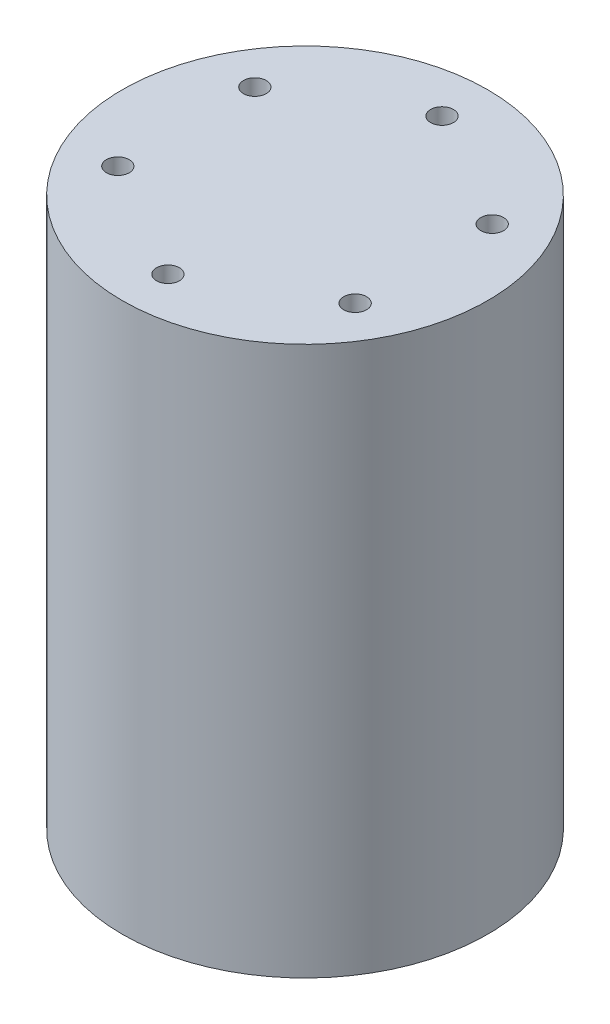
ISO-10303-21;
HEADER;
FILE_DESCRIPTION(('STEP AP214'),'2;1');
FILE_NAME('part.step','',(''),(''),'','','');
FILE_SCHEMA(('AUTOMOTIVE_DESIGN { 1 0 10303 214 1 1 1 1 }'));
ENDSEC;
DATA;
#1=APPLICATION_CONTEXT('core data for automotive mechanical design processes');
#2=APPLICATION_PROTOCOL_DEFINITION('international standard','automotive_design',2000,#1);
#3=PRODUCT_CONTEXT('',#1,'mechanical');
#4=PRODUCT('Part','Part','',(#3));
#5=PRODUCT_RELATED_PRODUCT_CATEGORY('part','',(#4));
#6=PRODUCT_DEFINITION_FORMATION('','',#4);
#7=PRODUCT_DEFINITION_CONTEXT('part definition',#1,'design');
#8=PRODUCT_DEFINITION('design','',#6,#7);
#9=PRODUCT_DEFINITION_SHAPE('','',#8);
#10=(LENGTH_UNIT() NAMED_UNIT(*) SI_UNIT(.MILLI.,.METRE.));
#11=(NAMED_UNIT(*) PLANE_ANGLE_UNIT() SI_UNIT($,.RADIAN.));
#12=(NAMED_UNIT(*) SI_UNIT($,.STERADIAN.) SOLID_ANGLE_UNIT());
#13=UNCERTAINTY_MEASURE_WITH_UNIT(LENGTH_MEASURE(1.E-05),#10,'distance_accuracy_value','');
#14=(GEOMETRIC_REPRESENTATION_CONTEXT(3) GLOBAL_UNCERTAINTY_ASSIGNED_CONTEXT((#13)) GLOBAL_UNIT_ASSIGNED_CONTEXT((#10,
#11,#12)) REPRESENTATION_CONTEXT('',''));
#15=CARTESIAN_POINT('',(0.,0.,0.));
#16=DIRECTION('',(0.,0.,1.));
#17=DIRECTION('',(1.,0.,0.));
#18=AXIS2_PLACEMENT_3D('',#15,#16,#17);
#19=CARTESIAN_POINT('',(0.,60.075,0.));
#20=DIRECTION('',(0.,-1.,0.));
#21=DIRECTION('',(0.,0.,-1.));
#22=AXIS2_PLACEMENT_3D('',#19,#20,#21);
#23=CYLINDRICAL_SURFACE('',#22,40.);
#24=CARTESIAN_POINT('',(0.,0.,0.));
#25=DIRECTION('',(0.,1.,0.));
#26=DIRECTION('',(0.,0.,1.));
#27=AXIS2_PLACEMENT_3D('',#24,#25,#26);
#28=CIRCLE('',#27,40.);
#29=CARTESIAN_POINT('',(0.,0.,40.));
#30=VERTEX_POINT('',#29);
#31=EDGE_CURVE('E11',#30,#30,#28,.T.);
#32=ORIENTED_EDGE('',*,*,#31,.T.);
#33=EDGE_LOOP('',(#32));
#34=FACE_BOUND('',#33,.T.);
#35=CARTESIAN_POINT('',(0.,120.15,0.));
#36=DIRECTION('',(0.,1.,0.));
#37=DIRECTION('',(0.,0.,1.));
#38=AXIS2_PLACEMENT_3D('',#35,#36,#37);
#39=CIRCLE('',#38,40.);
#40=CARTESIAN_POINT('',(0.,120.15,40.));
#41=VERTEX_POINT('',#40);
#42=EDGE_CURVE('E141',#41,#41,#39,.T.);
#43=ORIENTED_EDGE('',*,*,#42,.F.);
#44=EDGE_LOOP('',(#43));
#45=FACE_BOUND('',#44,.T.);
#46=ADVANCED_FACE('F39',(#34,#45),#23,.T.);
#47=CARTESIAN_POINT('',(0.,0.,0.));
#48=DIRECTION('',(0.,1.,0.));
#49=DIRECTION('',(0.,0.,1.));
#50=AXIS2_PLACEMENT_3D('',#47,#48,#49);
#51=PLANE('',#50);
#52=CARTESIAN_POINT('',(25.9807621135332,0.,15.));
#53=DIRECTION('',(0.,-1.,0.));
#54=DIRECTION('',(0.,0.,-1.));
#55=AXIS2_PLACEMENT_3D('',#52,#53,#54);
#56=CIRCLE('',#55,2.49999999999999);
#57=CARTESIAN_POINT('',(25.9807621135332,0.,12.5));
#58=VERTEX_POINT('',#57);
#59=EDGE_CURVE('E145',#58,#58,#56,.T.);
#60=ORIENTED_EDGE('',*,*,#59,.F.);
#61=EDGE_LOOP('',(#60));
#62=FACE_BOUND('',#61,.T.);
#63=CARTESIAN_POINT('',(25.9807621135332,0.,-15.));
#64=DIRECTION('',(0.,-1.,0.));
#65=DIRECTION('',(0.,0.,-1.));
#66=AXIS2_PLACEMENT_3D('',#63,#64,#65);
#67=CIRCLE('',#66,2.49999999999999);
#68=CARTESIAN_POINT('',(25.9807621135332,0.,-17.5));
#69=VERTEX_POINT('',#68);
#70=EDGE_CURVE('E153',#69,#69,#67,.T.);
#71=ORIENTED_EDGE('',*,*,#70,.F.);
#72=EDGE_LOOP('',(#71));
#73=FACE_BOUND('',#72,.T.);
#74=CARTESIAN_POINT('',(0.,0.,-30.));
#75=DIRECTION('',(0.,-1.,0.));
#76=DIRECTION('',(0.,0.,-1.));
#77=AXIS2_PLACEMENT_3D('',#74,#75,#76);
#78=CIRCLE('',#77,2.49999999999999);
#79=CARTESIAN_POINT('',(0.,0.,-32.5));
#80=VERTEX_POINT('',#79);
#81=EDGE_CURVE('E161',#80,#80,#78,.T.);
#82=ORIENTED_EDGE('',*,*,#81,.F.);
#83=EDGE_LOOP('',(#82));
#84=FACE_BOUND('',#83,.T.);
#85=CARTESIAN_POINT('',(-25.9807621135332,0.,-15.));
#86=DIRECTION('',(0.,-1.,0.));
#87=DIRECTION('',(0.,0.,-1.));
#88=AXIS2_PLACEMENT_3D('',#85,#86,#87);
#89=CIRCLE('',#88,2.49999999999999);
#90=CARTESIAN_POINT('',(-25.9807621135332,0.,-17.5));
#91=VERTEX_POINT('',#90);
#92=EDGE_CURVE('E169',#91,#91,#89,.T.);
#93=ORIENTED_EDGE('',*,*,#92,.F.);
#94=EDGE_LOOP('',(#93));
#95=FACE_BOUND('',#94,.T.);
#96=CARTESIAN_POINT('',(-25.9807621135332,0.,15.));
#97=DIRECTION('',(0.,-1.,0.));
#98=DIRECTION('',(0.,0.,-1.));
#99=AXIS2_PLACEMENT_3D('',#96,#97,#98);
#100=CIRCLE('',#99,2.49999999999999);
#101=CARTESIAN_POINT('',(-25.9807621135332,0.,12.5));
#102=VERTEX_POINT('',#101);
#103=EDGE_CURVE('E177',#102,#102,#100,.T.);
#104=ORIENTED_EDGE('',*,*,#103,.F.);
#105=EDGE_LOOP('',(#104));
#106=FACE_BOUND('',#105,.T.);
#107=CARTESIAN_POINT('',(0.,0.,30.));
#108=DIRECTION('',(0.,-1.,0.));
#109=DIRECTION('',(0.,0.,-1.));
#110=AXIS2_PLACEMENT_3D('',#107,#108,#109);
#111=CIRCLE('',#110,2.49999999999999);
#112=CARTESIAN_POINT('',(0.,0.,27.5));
#113=VERTEX_POINT('',#112);
#114=EDGE_CURVE('E185',#113,#113,#111,.T.);
#115=ORIENTED_EDGE('',*,*,#114,.F.);
#116=EDGE_LOOP('',(#115));
#117=FACE_BOUND('',#116,.T.);
#118=ORIENTED_EDGE('',*,*,#31,.F.);
#119=EDGE_LOOP('',(#118));
#120=FACE_BOUND('',#119,.T.);
#121=ADVANCED_FACE('F201',(#62,#73,#84,#95,#106,#117,#120),#51,.F.);
#122=CARTESIAN_POINT('',(0.,10.,30.));
#123=DIRECTION('',(0.,-1.,0.));
#124=DIRECTION('',(0.,0.,-1.));
#125=AXIS2_PLACEMENT_3D('',#122,#123,#124);
#126=CONICAL_SURFACE('',#125,2.5,1.02974425867665);
#127=CARTESIAN_POINT('',(0.,11.5021515475689,30.));
#128=VERTEX_POINT('',#127);
#129=VERTEX_LOOP('',#128);
#130=FACE_BOUND('',#129,.T.);
#131=CARTESIAN_POINT('',(0.,10.,30.));
#132=DIRECTION('',(0.,-1.,0.));
#133=DIRECTION('',(0.,0.,-1.));
#134=AXIS2_PLACEMENT_3D('',#131,#132,#133);
#135=CIRCLE('',#134,2.5);
#136=CARTESIAN_POINT('',(0.,10.,27.5));
#137=VERTEX_POINT('',#136);
#138=EDGE_CURVE('E47',#137,#137,#135,.T.);
#139=ORIENTED_EDGE('',*,*,#138,.T.);
#140=EDGE_LOOP('',(#139));
#141=FACE_BOUND('',#140,.T.);
#142=ADVANCED_FACE('F192',(#130,#141),#126,.F.);
#143=CARTESIAN_POINT('',(0.,0.,30.));
#144=DIRECTION('',(0.,-1.,0.));
#145=DIRECTION('',(0.,0.,-1.));
#146=AXIS2_PLACEMENT_3D('',#143,#144,#145);
#147=CYLINDRICAL_SURFACE('',#146,2.49999999999999);
#148=ORIENTED_EDGE('',*,*,#138,.F.);
#149=EDGE_LOOP('',(#148));
#150=FACE_BOUND('',#149,.T.);
#151=ORIENTED_EDGE('',*,*,#114,.T.);
#152=EDGE_LOOP('',(#151));
#153=FACE_BOUND('',#152,.T.);
#154=ADVANCED_FACE('F194',(#150,#153),#147,.F.);
#155=CARTESIAN_POINT('',(-25.9807621135332,10.,15.));
#156=DIRECTION('',(0.,-1.,0.));
#157=DIRECTION('',(0.,0.,-1.));
#158=AXIS2_PLACEMENT_3D('',#155,#156,#157);
#159=CONICAL_SURFACE('',#158,2.5,1.02974425867665);
#160=CARTESIAN_POINT('',(-25.9807621135332,11.5021515475689,15.));
#161=VERTEX_POINT('',#160);
#162=VERTEX_LOOP('',#161);
#163=FACE_BOUND('',#162,.T.);
#164=CARTESIAN_POINT('',(-25.9807621135332,10.,15.));
#165=DIRECTION('',(0.,-1.,0.));
#166=DIRECTION('',(0.,0.,-1.));
#167=AXIS2_PLACEMENT_3D('',#164,#165,#166);
#168=CIRCLE('',#167,2.5);
#169=CARTESIAN_POINT('',(-25.9807621135332,10.,12.5));
#170=VERTEX_POINT('',#169);
#171=EDGE_CURVE('E181',#170,#170,#168,.T.);
#172=ORIENTED_EDGE('',*,*,#171,.T.);
#173=EDGE_LOOP('',(#172));
#174=FACE_BOUND('',#173,.T.);
#175=ADVANCED_FACE('F197',(#163,#174),#159,.F.);
#176=CARTESIAN_POINT('',(-25.9807621135332,0.,15.));
#177=DIRECTION('',(0.,-1.,0.));
#178=DIRECTION('',(0.,0.,-1.));
#179=AXIS2_PLACEMENT_3D('',#176,#177,#178);
#180=CYLINDRICAL_SURFACE('',#179,2.49999999999999);
#181=ORIENTED_EDGE('',*,*,#171,.F.);
#182=EDGE_LOOP('',(#181));
#183=FACE_BOUND('',#182,.T.);
#184=ORIENTED_EDGE('',*,*,#103,.T.);
#185=EDGE_LOOP('',(#184));
#186=FACE_BOUND('',#185,.T.);
#187=ADVANCED_FACE('F257',(#183,#186),#180,.F.);
#188=CARTESIAN_POINT('',(-25.9807621135332,10.,-15.));
#189=DIRECTION('',(0.,-1.,0.));
#190=DIRECTION('',(0.,0.,-1.));
#191=AXIS2_PLACEMENT_3D('',#188,#189,#190);
#192=CONICAL_SURFACE('',#191,2.5,1.02974425867665);
#193=CARTESIAN_POINT('',(-25.9807621135332,11.5021515475689,-15.));
#194=VERTEX_POINT('',#193);
#195=VERTEX_LOOP('',#194);
#196=FACE_BOUND('',#195,.T.);
#197=CARTESIAN_POINT('',(-25.9807621135332,10.,-15.));
#198=DIRECTION('',(0.,-1.,0.));
#199=DIRECTION('',(0.,0.,-1.));
#200=AXIS2_PLACEMENT_3D('',#197,#198,#199);
#201=CIRCLE('',#200,2.5);
#202=CARTESIAN_POINT('',(-25.9807621135332,10.,-17.5));
#203=VERTEX_POINT('',#202);
#204=EDGE_CURVE('E173',#203,#203,#201,.T.);
#205=ORIENTED_EDGE('',*,*,#204,.T.);
#206=EDGE_LOOP('',(#205));
#207=FACE_BOUND('',#206,.T.);
#208=ADVANCED_FACE('F253',(#196,#207),#192,.F.);
#209=CARTESIAN_POINT('',(-25.9807621135332,0.,-15.));
#210=DIRECTION('',(0.,-1.,0.));
#211=DIRECTION('',(0.,0.,-1.));
#212=AXIS2_PLACEMENT_3D('',#209,#210,#211);
#213=CYLINDRICAL_SURFACE('',#212,2.5);
#214=ORIENTED_EDGE('',*,*,#204,.F.);
#215=EDGE_LOOP('',(#214));
#216=FACE_BOUND('',#215,.T.);
#217=ORIENTED_EDGE('',*,*,#92,.T.);
#218=EDGE_LOOP('',(#217));
#219=FACE_BOUND('',#218,.T.);
#220=ADVANCED_FACE('F249',(#216,#219),#213,.F.);
#221=CARTESIAN_POINT('',(0.,10.,-30.));
#222=DIRECTION('',(0.,-1.,0.));
#223=DIRECTION('',(0.,0.,-1.));
#224=AXIS2_PLACEMENT_3D('',#221,#222,#223);
#225=CONICAL_SURFACE('',#224,2.5,1.02974425867665);
#226=CARTESIAN_POINT('',(0.,11.5021515475689,-30.));
#227=VERTEX_POINT('',#226);
#228=VERTEX_LOOP('',#227);
#229=FACE_BOUND('',#228,.T.);
#230=CARTESIAN_POINT('',(0.,10.,-30.));
#231=DIRECTION('',(0.,-1.,0.));
#232=DIRECTION('',(0.,0.,-1.));
#233=AXIS2_PLACEMENT_3D('',#230,#231,#232);
#234=CIRCLE('',#233,2.5);
#235=CARTESIAN_POINT('',(0.,10.,-32.5));
#236=VERTEX_POINT('',#235);
#237=EDGE_CURVE('E165',#236,#236,#234,.T.);
#238=ORIENTED_EDGE('',*,*,#237,.T.);
#239=EDGE_LOOP('',(#238));
#240=FACE_BOUND('',#239,.T.);
#241=ADVANCED_FACE('F245',(#229,#240),#225,.F.);
#242=CARTESIAN_POINT('',(0.,0.,-30.));
#243=DIRECTION('',(0.,-1.,0.));
#244=DIRECTION('',(0.,0.,-1.));
#245=AXIS2_PLACEMENT_3D('',#242,#243,#244);
#246=CYLINDRICAL_SURFACE('',#245,2.49999999999999);
#247=ORIENTED_EDGE('',*,*,#237,.F.);
#248=EDGE_LOOP('',(#247));
#249=FACE_BOUND('',#248,.T.);
#250=ORIENTED_EDGE('',*,*,#81,.T.);
#251=EDGE_LOOP('',(#250));
#252=FACE_BOUND('',#251,.T.);
#253=ADVANCED_FACE('F241',(#249,#252),#246,.F.);
#254=CARTESIAN_POINT('',(25.9807621135332,10.,-15.));
#255=DIRECTION('',(0.,-1.,0.));
#256=DIRECTION('',(0.,0.,-1.));
#257=AXIS2_PLACEMENT_3D('',#254,#255,#256);
#258=CONICAL_SURFACE('',#257,2.5,1.02974425867665);
#259=CARTESIAN_POINT('',(25.9807621135331,11.5021515475689,-15.));
#260=VERTEX_POINT('',#259);
#261=VERTEX_LOOP('',#260);
#262=FACE_BOUND('',#261,.T.);
#263=CARTESIAN_POINT('',(25.9807621135332,10.,-15.));
#264=DIRECTION('',(0.,-1.,0.));
#265=DIRECTION('',(0.,0.,-1.));
#266=AXIS2_PLACEMENT_3D('',#263,#264,#265);
#267=CIRCLE('',#266,2.5);
#268=CARTESIAN_POINT('',(25.9807621135332,10.,-17.5));
#269=VERTEX_POINT('',#268);
#270=EDGE_CURVE('E157',#269,#269,#267,.T.);
#271=ORIENTED_EDGE('',*,*,#270,.T.);
#272=EDGE_LOOP('',(#271));
#273=FACE_BOUND('',#272,.T.);
#274=ADVANCED_FACE('F237',(#262,#273),#258,.F.);
#275=CARTESIAN_POINT('',(25.9807621135332,0.,-15.));
#276=DIRECTION('',(0.,-1.,0.));
#277=DIRECTION('',(0.,0.,-1.));
#278=AXIS2_PLACEMENT_3D('',#275,#276,#277);
#279=CYLINDRICAL_SURFACE('',#278,2.49999999999999);
#280=ORIENTED_EDGE('',*,*,#270,.F.);
#281=EDGE_LOOP('',(#280));
#282=FACE_BOUND('',#281,.T.);
#283=ORIENTED_EDGE('',*,*,#70,.T.);
#284=EDGE_LOOP('',(#283));
#285=FACE_BOUND('',#284,.T.);
#286=ADVANCED_FACE('F233',(#282,#285),#279,.F.);
#287=CARTESIAN_POINT('',(25.9807621135332,10.,15.));
#288=DIRECTION('',(0.,-1.,0.));
#289=DIRECTION('',(0.,0.,-1.));
#290=AXIS2_PLACEMENT_3D('',#287,#288,#289);
#291=CONICAL_SURFACE('',#290,2.5,1.02974425867665);
#292=CARTESIAN_POINT('',(25.9807621135332,11.5021515475689,15.));
#293=VERTEX_POINT('',#292);
#294=VERTEX_LOOP('',#293);
#295=FACE_BOUND('',#294,.T.);
#296=CARTESIAN_POINT('',(25.9807621135332,10.,15.));
#297=DIRECTION('',(0.,-1.,0.));
#298=DIRECTION('',(0.,0.,-1.));
#299=AXIS2_PLACEMENT_3D('',#296,#297,#298);
#300=CIRCLE('',#299,2.5);
#301=CARTESIAN_POINT('',(25.9807621135332,10.,12.5));
#302=VERTEX_POINT('',#301);
#303=EDGE_CURVE('E149',#302,#302,#300,.T.);
#304=ORIENTED_EDGE('',*,*,#303,.T.);
#305=EDGE_LOOP('',(#304));
#306=FACE_BOUND('',#305,.T.);
#307=ADVANCED_FACE('F224',(#295,#306),#291,.F.);
#308=CARTESIAN_POINT('',(25.9807621135332,0.,15.));
#309=DIRECTION('',(0.,-1.,0.));
#310=DIRECTION('',(0.,0.,-1.));
#311=AXIS2_PLACEMENT_3D('',#308,#309,#310);
#312=CYLINDRICAL_SURFACE('',#311,2.5);
#313=ORIENTED_EDGE('',*,*,#303,.F.);
#314=EDGE_LOOP('',(#313));
#315=FACE_BOUND('',#314,.T.);
#316=ORIENTED_EDGE('',*,*,#59,.T.);
#317=EDGE_LOOP('',(#316));
#318=FACE_BOUND('',#317,.T.);
#319=ADVANCED_FACE('F214',(#315,#318),#312,.F.);
#320=CARTESIAN_POINT('',(0.,120.15,0.));
#321=DIRECTION('',(0.,-1.,0.));
#322=DIRECTION('',(0.,0.,1.));
#323=AXIS2_PLACEMENT_3D('',#320,#321,#322);
#324=PLANE('',#323);
#325=CARTESIAN_POINT('',(25.9807621135332,120.15,15.));
#326=DIRECTION('',(0.,1.,0.));
#327=DIRECTION('',(0.,0.,1.));
#328=AXIS2_PLACEMENT_3D('',#325,#326,#327);
#329=CIRCLE('',#328,2.49999999999999);
#330=CARTESIAN_POINT('',(25.9807621135332,120.15,17.5));
#331=VERTEX_POINT('',#330);
#332=EDGE_CURVE('E96',#331,#331,#329,.T.);
#333=ORIENTED_EDGE('',*,*,#332,.F.);
#334=EDGE_LOOP('',(#333));
#335=FACE_BOUND('',#334,.T.);
#336=CARTESIAN_POINT('',(25.9807621135332,120.15,-15.));
#337=DIRECTION('',(0.,1.,0.));
#338=DIRECTION('',(0.,0.,1.));
#339=AXIS2_PLACEMENT_3D('',#336,#337,#338);
#340=CIRCLE('',#339,2.49999999999999);
#341=CARTESIAN_POINT('',(25.9807621135332,120.15,-12.5));
#342=VERTEX_POINT('',#341);
#343=EDGE_CURVE('E95',#342,#342,#340,.T.);
#344=ORIENTED_EDGE('',*,*,#343,.F.);
#345=EDGE_LOOP('',(#344));
#346=FACE_BOUND('',#345,.T.);
#347=CARTESIAN_POINT('',(0.,120.15,-30.));
#348=DIRECTION('',(0.,1.,0.));
#349=DIRECTION('',(0.,0.,1.));
#350=AXIS2_PLACEMENT_3D('',#347,#348,#349);
#351=CIRCLE('',#350,2.49999999999999);
#352=CARTESIAN_POINT('',(0.,120.15,-27.5));
#353=VERTEX_POINT('',#352);
#354=EDGE_CURVE('E109',#353,#353,#351,.T.);
#355=ORIENTED_EDGE('',*,*,#354,.F.);
#356=EDGE_LOOP('',(#355));
#357=FACE_BOUND('',#356,.T.);
#358=CARTESIAN_POINT('',(-25.9807621135332,120.15,-15.));
#359=DIRECTION('',(0.,1.,0.));
#360=DIRECTION('',(0.,0.,1.));
#361=AXIS2_PLACEMENT_3D('',#358,#359,#360);
#362=CIRCLE('',#361,2.49999999999999);
#363=CARTESIAN_POINT('',(-25.9807621135332,120.15,-12.5));
#364=VERTEX_POINT('',#363);
#365=EDGE_CURVE('E117',#364,#364,#362,.T.);
#366=ORIENTED_EDGE('',*,*,#365,.F.);
#367=EDGE_LOOP('',(#366));
#368=FACE_BOUND('',#367,.T.);
#369=CARTESIAN_POINT('',(-25.9807621135332,120.15,15.));
#370=DIRECTION('',(0.,1.,0.));
#371=DIRECTION('',(0.,0.,1.));
#372=AXIS2_PLACEMENT_3D('',#369,#370,#371);
#373=CIRCLE('',#372,2.49999999999999);
#374=CARTESIAN_POINT('',(-25.9807621135332,120.15,17.5));
#375=VERTEX_POINT('',#374);
#376=EDGE_CURVE('E125',#375,#375,#373,.T.);
#377=ORIENTED_EDGE('',*,*,#376,.F.);
#378=EDGE_LOOP('',(#377));
#379=FACE_BOUND('',#378,.T.);
#380=CARTESIAN_POINT('',(0.,120.15,30.));
#381=DIRECTION('',(0.,1.,0.));
#382=DIRECTION('',(0.,0.,1.));
#383=AXIS2_PLACEMENT_3D('',#380,#381,#382);
#384=CIRCLE('',#383,2.49999999999999);
#385=CARTESIAN_POINT('',(0.,120.15,32.5));
#386=VERTEX_POINT('',#385);
#387=EDGE_CURVE('E133',#386,#386,#384,.T.);
#388=ORIENTED_EDGE('',*,*,#387,.F.);
#389=EDGE_LOOP('',(#388));
#390=FACE_BOUND('',#389,.T.);
#391=ORIENTED_EDGE('',*,*,#42,.T.);
#392=EDGE_LOOP('',(#391));
#393=FACE_BOUND('',#392,.T.);
#394=ADVANCED_FACE('F211',(#335,#346,#357,#368,#379,#390,#393),#324,.F.);
#395=CARTESIAN_POINT('',(0.,110.15,30.));
#396=DIRECTION('',(0.,1.,0.));
#397=DIRECTION('',(0.,0.,1.));
#398=AXIS2_PLACEMENT_3D('',#395,#396,#397);
#399=CONICAL_SURFACE('',#398,2.5,1.02974425867665);
#400=CARTESIAN_POINT('',(0.,108.647848452431,30.));
#401=VERTEX_POINT('',#400);
#402=VERTEX_LOOP('',#401);
#403=FACE_BOUND('',#402,.T.);
#404=CARTESIAN_POINT('',(0.,110.15,30.));
#405=DIRECTION('',(0.,1.,0.));
#406=DIRECTION('',(0.,0.,1.));
#407=AXIS2_PLACEMENT_3D('',#404,#405,#406);
#408=CIRCLE('',#407,2.5);
#409=CARTESIAN_POINT('',(0.,110.15,32.5));
#410=VERTEX_POINT('',#409);
#411=EDGE_CURVE('E137',#410,#410,#408,.T.);
#412=ORIENTED_EDGE('',*,*,#411,.T.);
#413=EDGE_LOOP('',(#412));
#414=FACE_BOUND('',#413,.T.);
#415=ADVANCED_FACE('F213',(#403,#414),#399,.F.);
#416=CARTESIAN_POINT('',(0.,120.15,30.));
#417=DIRECTION('',(0.,1.,0.));
#418=DIRECTION('',(0.,0.,1.));
#419=AXIS2_PLACEMENT_3D('',#416,#417,#418);
#420=CYLINDRICAL_SURFACE('',#419,2.49999999999999);
#421=ORIENTED_EDGE('',*,*,#411,.F.);
#422=EDGE_LOOP('',(#421));
#423=FACE_BOUND('',#422,.T.);
#424=ORIENTED_EDGE('',*,*,#387,.T.);
#425=EDGE_LOOP('',(#424));
#426=FACE_BOUND('',#425,.T.);
#427=ADVANCED_FACE('F220',(#423,#426),#420,.F.);
#428=CARTESIAN_POINT('',(-25.9807621135332,110.15,15.));
#429=DIRECTION('',(0.,1.,0.));
#430=DIRECTION('',(0.,0.,1.));
#431=AXIS2_PLACEMENT_3D('',#428,#429,#430);
#432=CONICAL_SURFACE('',#431,2.5,1.02974425867665);
#433=CARTESIAN_POINT('',(-25.9807621135332,108.647848452431,15.));
#434=VERTEX_POINT('',#433);
#435=VERTEX_LOOP('',#434);
#436=FACE_BOUND('',#435,.T.);
#437=CARTESIAN_POINT('',(-25.9807621135332,110.15,15.));
#438=DIRECTION('',(0.,1.,0.));
#439=DIRECTION('',(0.,0.,1.));
#440=AXIS2_PLACEMENT_3D('',#437,#438,#439);
#441=CIRCLE('',#440,2.5);
#442=CARTESIAN_POINT('',(-25.9807621135332,110.15,17.5));
#443=VERTEX_POINT('',#442);
#444=EDGE_CURVE('E129',#443,#443,#441,.T.);
#445=ORIENTED_EDGE('',*,*,#444,.T.);
#446=EDGE_LOOP('',(#445));
#447=FACE_BOUND('',#446,.T.);
#448=ADVANCED_FACE('F337',(#436,#447),#432,.F.);
#449=CARTESIAN_POINT('',(-25.9807621135332,120.15,15.));
#450=DIRECTION('',(0.,1.,0.));
#451=DIRECTION('',(0.,0.,1.));
#452=AXIS2_PLACEMENT_3D('',#449,#450,#451);
#453=CYLINDRICAL_SURFACE('',#452,2.49999999999999);
#454=ORIENTED_EDGE('',*,*,#444,.F.);
#455=EDGE_LOOP('',(#454));
#456=FACE_BOUND('',#455,.T.);
#457=ORIENTED_EDGE('',*,*,#376,.T.);
#458=EDGE_LOOP('',(#457));
#459=FACE_BOUND('',#458,.T.);
#460=ADVANCED_FACE('F346',(#456,#459),#453,.F.);
#461=CARTESIAN_POINT('',(-25.9807621135332,110.15,-15.));
#462=DIRECTION('',(0.,1.,0.));
#463=DIRECTION('',(0.,0.,1.));
#464=AXIS2_PLACEMENT_3D('',#461,#462,#463);
#465=CONICAL_SURFACE('',#464,2.5,1.02974425867665);
#466=CARTESIAN_POINT('',(-25.9807621135332,108.647848452431,-15.));
#467=VERTEX_POINT('',#466);
#468=VERTEX_LOOP('',#467);
#469=FACE_BOUND('',#468,.T.);
#470=CARTESIAN_POINT('',(-25.9807621135332,110.15,-15.));
#471=DIRECTION('',(0.,1.,0.));
#472=DIRECTION('',(0.,0.,1.));
#473=AXIS2_PLACEMENT_3D('',#470,#471,#472);
#474=CIRCLE('',#473,2.5);
#475=CARTESIAN_POINT('',(-25.9807621135332,110.15,-12.5));
#476=VERTEX_POINT('',#475);
#477=EDGE_CURVE('E121',#476,#476,#474,.T.);
#478=ORIENTED_EDGE('',*,*,#477,.T.);
#479=EDGE_LOOP('',(#478));
#480=FACE_BOUND('',#479,.T.);
#481=ADVANCED_FACE('F356',(#469,#480),#465,.F.);
#482=CARTESIAN_POINT('',(-25.9807621135332,120.15,-15.));
#483=DIRECTION('',(0.,1.,0.));
#484=DIRECTION('',(0.,0.,1.));
#485=AXIS2_PLACEMENT_3D('',#482,#483,#484);
#486=CYLINDRICAL_SURFACE('',#485,2.5);
#487=ORIENTED_EDGE('',*,*,#477,.F.);
#488=EDGE_LOOP('',(#487));
#489=FACE_BOUND('',#488,.T.);
#490=ORIENTED_EDGE('',*,*,#365,.T.);
#491=EDGE_LOOP('',(#490));
#492=FACE_BOUND('',#491,.T.);
#493=ADVANCED_FACE('F366',(#489,#492),#486,.F.);
#494=CARTESIAN_POINT('',(0.,110.15,-30.));
#495=DIRECTION('',(0.,1.,0.));
#496=DIRECTION('',(0.,0.,1.));
#497=AXIS2_PLACEMENT_3D('',#494,#495,#496);
#498=CONICAL_SURFACE('',#497,2.5,1.02974425867665);
#499=CARTESIAN_POINT('',(0.,108.647848452431,-30.));
#500=VERTEX_POINT('',#499);
#501=VERTEX_LOOP('',#500);
#502=FACE_BOUND('',#501,.T.);
#503=CARTESIAN_POINT('',(0.,110.15,-30.));
#504=DIRECTION('',(0.,1.,0.));
#505=DIRECTION('',(0.,0.,1.));
#506=AXIS2_PLACEMENT_3D('',#503,#504,#505);
#507=CIRCLE('',#506,2.5);
#508=CARTESIAN_POINT('',(0.,110.15,-27.5));
#509=VERTEX_POINT('',#508);
#510=EDGE_CURVE('E113',#509,#509,#507,.T.);
#511=ORIENTED_EDGE('',*,*,#510,.T.);
#512=EDGE_LOOP('',(#511));
#513=FACE_BOUND('',#512,.T.);
#514=ADVANCED_FACE('F376',(#502,#513),#498,.F.);
#515=CARTESIAN_POINT('',(0.,120.15,-30.));
#516=DIRECTION('',(0.,1.,0.));
#517=DIRECTION('',(0.,0.,1.));
#518=AXIS2_PLACEMENT_3D('',#515,#516,#517);
#519=CYLINDRICAL_SURFACE('',#518,2.49999999999999);
#520=ORIENTED_EDGE('',*,*,#510,.F.);
#521=EDGE_LOOP('',(#520));
#522=FACE_BOUND('',#521,.T.);
#523=ORIENTED_EDGE('',*,*,#354,.T.);
#524=EDGE_LOOP('',(#523));
#525=FACE_BOUND('',#524,.T.);
#526=ADVANCED_FACE('F386',(#522,#525),#519,.F.);
#527=CARTESIAN_POINT('',(25.9807621135332,110.15,-15.));
#528=DIRECTION('',(0.,1.,0.));
#529=DIRECTION('',(0.,0.,1.));
#530=AXIS2_PLACEMENT_3D('',#527,#528,#529);
#531=CONICAL_SURFACE('',#530,2.5,1.02974425867665);
#532=CARTESIAN_POINT('',(25.9807621135331,108.647848452431,-15.));
#533=VERTEX_POINT('',#532);
#534=VERTEX_LOOP('',#533);
#535=FACE_BOUND('',#534,.T.);
#536=CARTESIAN_POINT('',(25.9807621135332,110.15,-15.));
#537=DIRECTION('',(0.,1.,0.));
#538=DIRECTION('',(0.,0.,1.));
#539=AXIS2_PLACEMENT_3D('',#536,#537,#538);
#540=CIRCLE('',#539,2.5);
#541=CARTESIAN_POINT('',(25.9807621135332,110.15,-12.5));
#542=VERTEX_POINT('',#541);
#543=EDGE_CURVE('E101',#542,#542,#540,.T.);
#544=ORIENTED_EDGE('',*,*,#543,.T.);
#545=EDGE_LOOP('',(#544));
#546=FACE_BOUND('',#545,.T.);
#547=ADVANCED_FACE('F396',(#535,#546),#531,.F.);
#548=CARTESIAN_POINT('',(25.9807621135332,120.15,-15.));
#549=DIRECTION('',(0.,1.,0.));
#550=DIRECTION('',(0.,0.,1.));
#551=AXIS2_PLACEMENT_3D('',#548,#549,#550);
#552=CYLINDRICAL_SURFACE('',#551,2.49999999999999);
#553=ORIENTED_EDGE('',*,*,#543,.F.);
#554=EDGE_LOOP('',(#553));
#555=FACE_BOUND('',#554,.T.);
#556=ORIENTED_EDGE('',*,*,#343,.T.);
#557=EDGE_LOOP('',(#556));
#558=FACE_BOUND('',#557,.T.);
#559=ADVANCED_FACE('F88',(#555,#558),#552,.F.);
#560=CARTESIAN_POINT('',(25.9807621135332,110.15,15.));
#561=DIRECTION('',(0.,1.,0.));
#562=DIRECTION('',(0.,0.,1.));
#563=AXIS2_PLACEMENT_3D('',#560,#561,#562);
#564=CONICAL_SURFACE('',#563,2.5,1.02974425867665);
#565=CARTESIAN_POINT('',(25.9807621135332,108.647848452431,15.));
#566=VERTEX_POINT('',#565);
#567=VERTEX_LOOP('',#566);
#568=FACE_BOUND('',#567,.T.);
#569=CARTESIAN_POINT('',(25.9807621135332,110.15,15.));
#570=DIRECTION('',(0.,1.,0.));
#571=DIRECTION('',(0.,0.,1.));
#572=AXIS2_PLACEMENT_3D('',#569,#570,#571);
#573=CIRCLE('',#572,2.5);
#574=CARTESIAN_POINT('',(25.9807621135332,110.15,17.5));
#575=VERTEX_POINT('',#574);
#576=EDGE_CURVE('E92',#575,#575,#573,.T.);
#577=ORIENTED_EDGE('',*,*,#576,.T.);
#578=EDGE_LOOP('',(#577));
#579=FACE_BOUND('',#578,.T.);
#580=ADVANCED_FACE('F84',(#568,#579),#564,.F.);
#581=CARTESIAN_POINT('',(25.9807621135332,120.15,15.));
#582=DIRECTION('',(0.,1.,0.));
#583=DIRECTION('',(0.,0.,1.));
#584=AXIS2_PLACEMENT_3D('',#581,#582,#583);
#585=CYLINDRICAL_SURFACE('',#584,2.5);
#586=ORIENTED_EDGE('',*,*,#576,.F.);
#587=EDGE_LOOP('',(#586));
#588=FACE_BOUND('',#587,.T.);
#589=ORIENTED_EDGE('',*,*,#332,.T.);
#590=EDGE_LOOP('',(#589));
#591=FACE_BOUND('',#590,.T.);
#592=ADVANCED_FACE('F87',(#588,#591),#585,.F.);
#593=CLOSED_SHELL('',(#46,#121,#142,#154,#175,#187,#208,#220,#241,#253,#274,#286,#307,#319,#394,
#415,#427,#448,#460,#481,#493,#514,#526,#547,#559,#580,#592));
#594=MANIFOLD_SOLID_BREP('B2',#593);
#595=ADVANCED_BREP_SHAPE_REPRESENTATION('',(#18,#594),#14);
#596=SHAPE_DEFINITION_REPRESENTATION(#9,#595);
ENDSEC;
END-ISO-10303-21;
